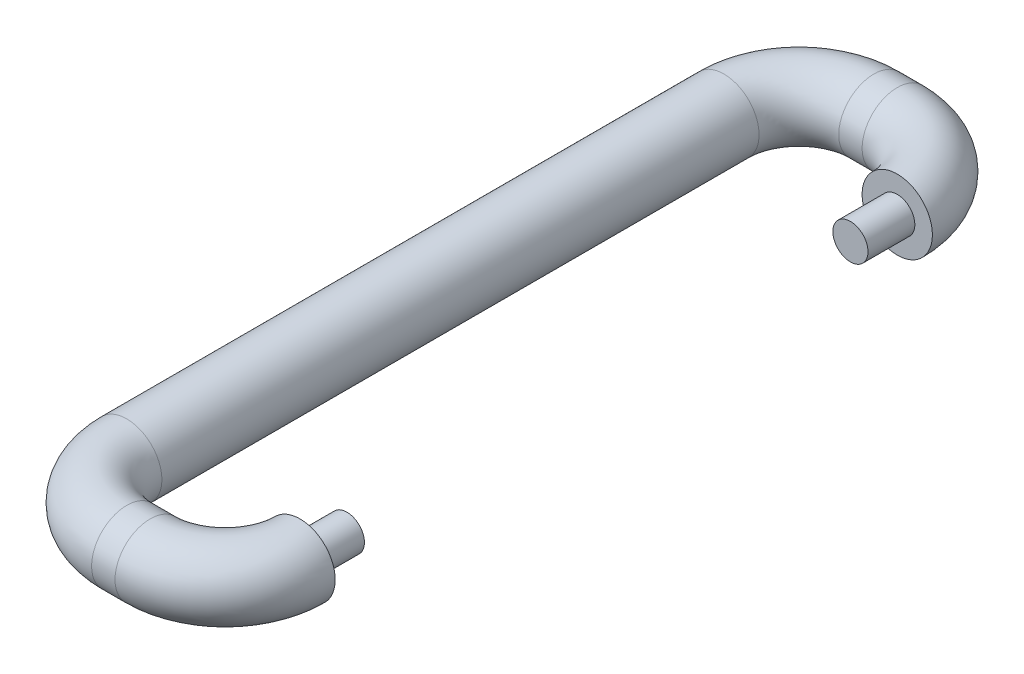
ISO-10303-21;
HEADER;
FILE_DESCRIPTION(('STEP AP214'),'2;1');
FILE_NAME('part.step','',(''),(''),'','','');
FILE_SCHEMA(('AUTOMOTIVE_DESIGN { 1 0 10303 214 1 1 1 1 }'));
ENDSEC;
DATA;
#1=APPLICATION_CONTEXT('core data for automotive mechanical design processes');
#2=APPLICATION_PROTOCOL_DEFINITION('international standard','automotive_design',2000,#1);
#3=PRODUCT_CONTEXT('',#1,'mechanical');
#4=PRODUCT('Part','Part','',(#3));
#5=PRODUCT_RELATED_PRODUCT_CATEGORY('part','',(#4));
#6=PRODUCT_DEFINITION_FORMATION('','',#4);
#7=PRODUCT_DEFINITION_CONTEXT('part definition',#1,'design');
#8=PRODUCT_DEFINITION('design','',#6,#7);
#9=PRODUCT_DEFINITION_SHAPE('','',#8);
#10=(LENGTH_UNIT() NAMED_UNIT(*) SI_UNIT(.MILLI.,.METRE.));
#11=(NAMED_UNIT(*) PLANE_ANGLE_UNIT() SI_UNIT($,.RADIAN.));
#12=(NAMED_UNIT(*) SI_UNIT($,.STERADIAN.) SOLID_ANGLE_UNIT());
#13=UNCERTAINTY_MEASURE_WITH_UNIT(LENGTH_MEASURE(1.E-05),#10,'distance_accuracy_value','');
#14=(GEOMETRIC_REPRESENTATION_CONTEXT(3) GLOBAL_UNCERTAINTY_ASSIGNED_CONTEXT((#13)) GLOBAL_UNIT_ASSIGNED_CONTEXT((#10,
#11,#12)) REPRESENTATION_CONTEXT('',''));
#15=CARTESIAN_POINT('',(0.,0.,0.));
#16=DIRECTION('',(0.,0.,1.));
#17=DIRECTION('',(1.,0.,0.));
#18=AXIS2_PLACEMENT_3D('',#15,#16,#17);
#19=CARTESIAN_POINT('',(0.,0.,127.5));
#20=DIRECTION('',(0.,0.,-1.));
#21=DIRECTION('',(-1.,0.,0.));
#22=AXIS2_PLACEMENT_3D('',#19,#20,#21);
#23=CYLINDRICAL_SURFACE('',#22,7.5);
#24=CARTESIAN_POINT('',(0.,0.,127.5));
#25=DIRECTION('',(0.,0.,1.));
#26=DIRECTION('',(1.,0.,0.));
#27=AXIS2_PLACEMENT_3D('',#24,#25,#26);
#28=CIRCLE('',#27,7.5);
#29=CARTESIAN_POINT('',(-7.50000000000001,0.,127.5));
#30=VERTEX_POINT('',#29);
#31=EDGE_CURVE('E38',#30,#30,#28,.T.);
#32=ORIENTED_EDGE('',*,*,#31,.F.);
#33=EDGE_LOOP('',(#32));
#34=FACE_BOUND('',#33,.T.);
#35=CARTESIAN_POINT('',(0.,0.,0.));
#36=DIRECTION('',(0.,0.,-1.));
#37=DIRECTION('',(-1.,0.,0.));
#38=AXIS2_PLACEMENT_3D('',#35,#36,#37);
#39=CIRCLE('',#38,7.5);
#40=CARTESIAN_POINT('',(-7.5,0.,0.));
#41=VERTEX_POINT('',#40);
#42=EDGE_CURVE('E66',#41,#41,#39,.T.);
#43=ORIENTED_EDGE('',*,*,#42,.F.);
#44=EDGE_LOOP('',(#43));
#45=FACE_BOUND('',#44,.T.);
#46=ADVANCED_FACE('F35',(#34,#45),#23,.T.);
#47=CARTESIAN_POINT('',(16.,0.,127.5));
#48=DIRECTION('',(0.,-1.,0.));
#49=DIRECTION('',(0.,0.,-1.));
#50=AXIS2_PLACEMENT_3D('',#47,#48,#49);
#51=TOROIDAL_SURFACE('',#50,16.,7.5);
#52=CARTESIAN_POINT('',(16.0000000000001,0.,143.5));
#53=DIRECTION('',(1.,0.,0.));
#54=DIRECTION('',(0.,0.,-1.));
#55=AXIS2_PLACEMENT_3D('',#52,#53,#54);
#56=CIRCLE('',#55,7.5);
#57=CARTESIAN_POINT('',(16.0000000000001,0.,151.));
#58=VERTEX_POINT('',#57);
#59=EDGE_CURVE('E71',#58,#58,#56,.T.);
#60=CARTESIAN_POINT('',(16.,0.,127.5));
#61=DIRECTION('',(0.,-1.,0.));
#62=DIRECTION('',(0.,0.,-1.));
#63=AXIS2_PLACEMENT_3D('',#60,#61,#62);
#64=CIRCLE('',#63,23.5);
#65=EDGE_CURVE('',#58,#30,#64,.T.);
#66=ORIENTED_EDGE('',*,*,#59,.F.);
#67=ORIENTED_EDGE('',*,*,#31,.T.);
#68=ORIENTED_EDGE('',*,*,#65,.T.);
#69=ORIENTED_EDGE('',*,*,#65,.F.);
#70=EDGE_LOOP('',(#66,#68,#67,#69));
#71=FACE_BOUND('',#70,.T.);
#72=ADVANCED_FACE('F78',(#71),#51,.T.);
#73=CARTESIAN_POINT('',(16.,0.,0.));
#74=DIRECTION('',(0.,1.,0.));
#75=DIRECTION('',(0.,0.,1.));
#76=AXIS2_PLACEMENT_3D('',#73,#74,#75);
#77=TOROIDAL_SURFACE('',#76,16.,7.5);
#78=CARTESIAN_POINT('',(16.,0.,-16.));
#79=DIRECTION('',(1.,0.,0.));
#80=DIRECTION('',(0.,0.,-1.));
#81=AXIS2_PLACEMENT_3D('',#78,#79,#80);
#82=CIRCLE('',#81,7.5);
#83=CARTESIAN_POINT('',(16.0000000000001,0.,-23.5));
#84=VERTEX_POINT('',#83);
#85=EDGE_CURVE('E69',#84,#84,#82,.T.);
#86=CARTESIAN_POINT('',(16.,0.,0.));
#87=DIRECTION('',(0.,1.,0.));
#88=DIRECTION('',(0.,0.,1.));
#89=AXIS2_PLACEMENT_3D('',#86,#87,#88);
#90=CIRCLE('',#89,23.5);
#91=EDGE_CURVE('',#84,#41,#90,.T.);
#92=ORIENTED_EDGE('',*,*,#85,.F.);
#93=ORIENTED_EDGE('',*,*,#42,.T.);
#94=ORIENTED_EDGE('',*,*,#91,.T.);
#95=ORIENTED_EDGE('',*,*,#91,.F.);
#96=EDGE_LOOP('',(#92,#94,#93,#95));
#97=FACE_BOUND('',#96,.T.);
#98=ADVANCED_FACE('F84',(#97),#77,.T.);
#99=CARTESIAN_POINT('',(20.9999999999995,0.,-16.));
#100=DIRECTION('',(-1.,0.,0.));
#101=DIRECTION('',(0.,0.,1.));
#102=AXIS2_PLACEMENT_3D('',#99,#100,#101);
#103=CYLINDRICAL_SURFACE('',#102,7.5);
#104=CARTESIAN_POINT('',(20.9999999999995,0.,-16.));
#105=DIRECTION('',(1.,0.,0.));
#106=DIRECTION('',(0.,0.,-1.));
#107=AXIS2_PLACEMENT_3D('',#104,#105,#106);
#108=CIRCLE('',#107,7.5);
#109=CARTESIAN_POINT('',(20.9999999999995,0.,-23.5));
#110=VERTEX_POINT('',#109);
#111=EDGE_CURVE('E63',#110,#110,#108,.T.);
#112=ORIENTED_EDGE('',*,*,#111,.F.);
#113=EDGE_LOOP('',(#112));
#114=FACE_BOUND('',#113,.T.);
#115=ORIENTED_EDGE('',*,*,#85,.T.);
#116=EDGE_LOOP('',(#115));
#117=FACE_BOUND('',#116,.T.);
#118=ADVANCED_FACE('F86',(#114,#117),#103,.T.);
#119=CARTESIAN_POINT('',(21.0000000000001,0.,143.5));
#120=DIRECTION('',(-1.,0.,0.));
#121=DIRECTION('',(0.,0.,1.));
#122=AXIS2_PLACEMENT_3D('',#119,#120,#121);
#123=CYLINDRICAL_SURFACE('',#122,7.50000000000001);
#124=CARTESIAN_POINT('',(21.0000000000001,0.,143.5));
#125=DIRECTION('',(1.,0.,0.));
#126=DIRECTION('',(0.,0.,-1.));
#127=AXIS2_PLACEMENT_3D('',#124,#125,#126);
#128=CIRCLE('',#127,7.50000000000001);
#129=CARTESIAN_POINT('',(21.0000000000001,0.,151.));
#130=VERTEX_POINT('',#129);
#131=EDGE_CURVE('E60',#130,#130,#128,.T.);
#132=ORIENTED_EDGE('',*,*,#131,.F.);
#133=EDGE_LOOP('',(#132));
#134=FACE_BOUND('',#133,.T.);
#135=ORIENTED_EDGE('',*,*,#59,.T.);
#136=EDGE_LOOP('',(#135));
#137=FACE_BOUND('',#136,.T.);
#138=ADVANCED_FACE('F93',(#134,#137),#123,.T.);
#139=CARTESIAN_POINT('',(20.9999999999996,0.,0.));
#140=DIRECTION('',(0.,1.,0.));
#141=DIRECTION('',(0.,0.,1.));
#142=AXIS2_PLACEMENT_3D('',#139,#140,#141);
#143=TOROIDAL_SURFACE('',#142,16.,7.5);
#144=CARTESIAN_POINT('',(36.9999999999996,0.,0.));
#145=DIRECTION('',(0.,0.,1.));
#146=DIRECTION('',(1.,0.,0.));
#147=AXIS2_PLACEMENT_3D('',#144,#145,#146);
#148=CIRCLE('',#147,7.5);
#149=CARTESIAN_POINT('',(44.4999999999996,0.,0.));
#150=VERTEX_POINT('',#149);
#151=EDGE_CURVE('E57',#150,#150,#148,.T.);
#152=CARTESIAN_POINT('',(20.9999999999996,0.,0.));
#153=DIRECTION('',(0.,1.,0.));
#154=DIRECTION('',(0.,0.,1.));
#155=AXIS2_PLACEMENT_3D('',#152,#153,#154);
#156=CIRCLE('',#155,23.5);
#157=EDGE_CURVE('',#150,#110,#156,.T.);
#158=ORIENTED_EDGE('',*,*,#151,.F.);
#159=ORIENTED_EDGE('',*,*,#111,.T.);
#160=ORIENTED_EDGE('',*,*,#157,.T.);
#161=ORIENTED_EDGE('',*,*,#157,.F.);
#162=EDGE_LOOP('',(#158,#160,#159,#161));
#163=FACE_BOUND('',#162,.T.);
#164=ADVANCED_FACE('F101',(#163),#143,.T.);
#165=CARTESIAN_POINT('',(36.9999999999996,0.,0.));
#166=DIRECTION('',(0.,0.,1.));
#167=DIRECTION('',(1.,0.,0.));
#168=AXIS2_PLACEMENT_3D('',#165,#166,#167);
#169=PLANE('',#168);
#170=CARTESIAN_POINT('',(36.9999999999995,0.,0.));
#171=DIRECTION('',(0.,0.,1.));
#172=DIRECTION('',(1.,0.,0.));
#173=AXIS2_PLACEMENT_3D('',#170,#171,#172);
#174=CIRCLE('',#173,3.75000000000001);
#175=CARTESIAN_POINT('',(40.7499999999996,0.,0.));
#176=VERTEX_POINT('',#175);
#177=EDGE_CURVE('E42',#176,#176,#174,.T.);
#178=ORIENTED_EDGE('',*,*,#177,.F.);
#179=EDGE_LOOP('',(#178));
#180=FACE_BOUND('',#179,.T.);
#181=ORIENTED_EDGE('',*,*,#151,.T.);
#182=EDGE_LOOP('',(#181));
#183=FACE_BOUND('',#182,.T.);
#184=ADVANCED_FACE('F105',(#180,#183),#169,.T.);
#185=CARTESIAN_POINT('',(21.,0.,127.5));
#186=DIRECTION('',(0.,-1.,0.));
#187=DIRECTION('',(0.,0.,-1.));
#188=AXIS2_PLACEMENT_3D('',#185,#186,#187);
#189=TOROIDAL_SURFACE('',#188,16.,7.50000000000001);
#190=CARTESIAN_POINT('',(37.,0.,127.5));
#191=DIRECTION('',(0.,0.,-1.));
#192=DIRECTION('',(-1.,0.,0.));
#193=AXIS2_PLACEMENT_3D('',#190,#191,#192);
#194=CIRCLE('',#193,7.50000000000001);
#195=CARTESIAN_POINT('',(44.5,0.,127.5));
#196=VERTEX_POINT('',#195);
#197=EDGE_CURVE('E53',#196,#196,#194,.T.);
#198=CARTESIAN_POINT('',(21.,0.,127.5));
#199=DIRECTION('',(0.,-1.,0.));
#200=DIRECTION('',(0.,0.,-1.));
#201=AXIS2_PLACEMENT_3D('',#198,#199,#200);
#202=CIRCLE('',#201,23.5);
#203=EDGE_CURVE('',#196,#130,#202,.T.);
#204=ORIENTED_EDGE('',*,*,#197,.F.);
#205=ORIENTED_EDGE('',*,*,#131,.T.);
#206=ORIENTED_EDGE('',*,*,#203,.T.);
#207=ORIENTED_EDGE('',*,*,#203,.F.);
#208=EDGE_LOOP('',(#204,#206,#205,#207));
#209=FACE_BOUND('',#208,.T.);
#210=ADVANCED_FACE('F109',(#209),#189,.T.);
#211=CARTESIAN_POINT('',(37.,0.,127.5));
#212=DIRECTION('',(0.,0.,-1.));
#213=DIRECTION('',(-1.,0.,0.));
#214=AXIS2_PLACEMENT_3D('',#211,#212,#213);
#215=PLANE('',#214);
#216=CARTESIAN_POINT('',(37.,0.,127.5));
#217=DIRECTION('',(0.,0.,-1.));
#218=DIRECTION('',(-1.,0.,0.));
#219=AXIS2_PLACEMENT_3D('',#216,#217,#218);
#220=CIRCLE('',#219,3.75);
#221=CARTESIAN_POINT('',(33.25,0.,127.5));
#222=VERTEX_POINT('',#221);
#223=EDGE_CURVE('E10',#222,#222,#220,.T.);
#224=ORIENTED_EDGE('',*,*,#223,.F.);
#225=EDGE_LOOP('',(#224));
#226=FACE_BOUND('',#225,.T.);
#227=ORIENTED_EDGE('',*,*,#197,.T.);
#228=EDGE_LOOP('',(#227));
#229=FACE_BOUND('',#228,.T.);
#230=ADVANCED_FACE('F113',(#226,#229),#215,.T.);
#231=CARTESIAN_POINT('',(36.9999999999995,0.,10.));
#232=DIRECTION('',(0.,0.,-1.));
#233=DIRECTION('',(-1.,0.,0.));
#234=AXIS2_PLACEMENT_3D('',#231,#232,#233);
#235=CYLINDRICAL_SURFACE('',#234,3.75000000000001);
#236=CARTESIAN_POINT('',(36.9999999999995,0.,10.));
#237=DIRECTION('',(0.,0.,1.));
#238=DIRECTION('',(1.,0.,0.));
#239=AXIS2_PLACEMENT_3D('',#236,#237,#238);
#240=CIRCLE('',#239,3.75000000000001);
#241=CARTESIAN_POINT('',(40.7499999999996,0.,10.));
#242=VERTEX_POINT('',#241);
#243=EDGE_CURVE('E51',#242,#242,#240,.T.);
#244=ORIENTED_EDGE('',*,*,#243,.F.);
#245=EDGE_LOOP('',(#244));
#246=FACE_BOUND('',#245,.T.);
#247=ORIENTED_EDGE('',*,*,#177,.T.);
#248=EDGE_LOOP('',(#247));
#249=FACE_BOUND('',#248,.T.);
#250=ADVANCED_FACE('F117',(#246,#249),#235,.T.);
#251=CARTESIAN_POINT('',(36.9999999999995,0.,10.));
#252=DIRECTION('',(0.,0.,1.));
#253=DIRECTION('',(1.,0.,0.));
#254=AXIS2_PLACEMENT_3D('',#251,#252,#253);
#255=PLANE('',#254);
#256=ORIENTED_EDGE('',*,*,#243,.T.);
#257=EDGE_LOOP('',(#256));
#258=FACE_BOUND('',#257,.T.);
#259=ADVANCED_FACE('F121',(#258),#255,.T.);
#260=CARTESIAN_POINT('',(36.9999999999999,0.,117.5));
#261=DIRECTION('',(0.,0.,1.));
#262=DIRECTION('',(1.,0.,0.));
#263=AXIS2_PLACEMENT_3D('',#260,#261,#262);
#264=CYLINDRICAL_SURFACE('',#263,3.75);
#265=CARTESIAN_POINT('',(36.9999999999999,0.,117.5));
#266=DIRECTION('',(0.,0.,-1.));
#267=DIRECTION('',(-1.,0.,0.));
#268=AXIS2_PLACEMENT_3D('',#265,#266,#267);
#269=CIRCLE('',#268,3.75);
#270=CARTESIAN_POINT('',(33.2499999999999,0.,117.5));
#271=VERTEX_POINT('',#270);
#272=EDGE_CURVE('E50',#271,#271,#269,.T.);
#273=ORIENTED_EDGE('',*,*,#272,.F.);
#274=EDGE_LOOP('',(#273));
#275=FACE_BOUND('',#274,.T.);
#276=ORIENTED_EDGE('',*,*,#223,.T.);
#277=EDGE_LOOP('',(#276));
#278=FACE_BOUND('',#277,.T.);
#279=ADVANCED_FACE('F125',(#275,#278),#264,.T.);
#280=CARTESIAN_POINT('',(36.9999999999999,0.,117.5));
#281=DIRECTION('',(0.,0.,-1.));
#282=DIRECTION('',(-1.,0.,0.));
#283=AXIS2_PLACEMENT_3D('',#280,#281,#282);
#284=PLANE('',#283);
#285=ORIENTED_EDGE('',*,*,#272,.T.);
#286=EDGE_LOOP('',(#285));
#287=FACE_BOUND('',#286,.T.);
#288=ADVANCED_FACE('F129',(#287),#284,.T.);
#289=CLOSED_SHELL('',(#46,#72,#98,#118,#138,#164,#184,#210,#230,#250,#259,#279,#288));
#290=MANIFOLD_SOLID_BREP('B2',#289);
#291=ADVANCED_BREP_SHAPE_REPRESENTATION('',(#18,#290),#14);
#292=SHAPE_DEFINITION_REPRESENTATION(#9,#291);
ENDSEC;
END-ISO-10303-21;
